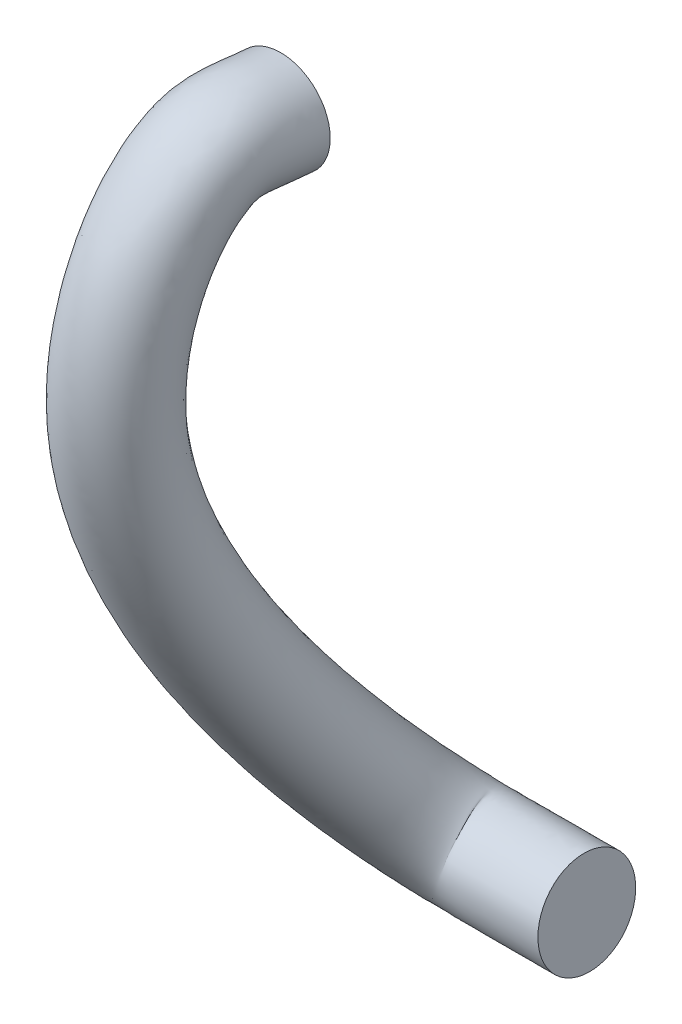
ISO-10303-21;
HEADER;
FILE_DESCRIPTION(('STEP AP214'),'2;1');
FILE_NAME('part.step','',(''),(''),'','','');
FILE_SCHEMA(('AUTOMOTIVE_DESIGN { 1 0 10303 214 1 1 1 1 }'));
ENDSEC;
DATA;
#1=APPLICATION_CONTEXT('core data for automotive mechanical design processes');
#2=APPLICATION_PROTOCOL_DEFINITION('international standard','automotive_design',2000,#1);
#3=PRODUCT_CONTEXT('',#1,'mechanical');
#4=PRODUCT('Part','Part','',(#3));
#5=PRODUCT_RELATED_PRODUCT_CATEGORY('part','',(#4));
#6=PRODUCT_DEFINITION_FORMATION('','',#4);
#7=PRODUCT_DEFINITION_CONTEXT('part definition',#1,'design');
#8=PRODUCT_DEFINITION('design','',#6,#7);
#9=PRODUCT_DEFINITION_SHAPE('','',#8);
#10=(LENGTH_UNIT() NAMED_UNIT(*) SI_UNIT(.MILLI.,.METRE.));
#11=(NAMED_UNIT(*) PLANE_ANGLE_UNIT() SI_UNIT($,.RADIAN.));
#12=(NAMED_UNIT(*) SI_UNIT($,.STERADIAN.) SOLID_ANGLE_UNIT());
#13=UNCERTAINTY_MEASURE_WITH_UNIT(LENGTH_MEASURE(1.E-05),#10,'distance_accuracy_value','');
#14=(GEOMETRIC_REPRESENTATION_CONTEXT(3) GLOBAL_UNCERTAINTY_ASSIGNED_CONTEXT((#13)) GLOBAL_UNIT_ASSIGNED_CONTEXT((#10,
#11,#12)) REPRESENTATION_CONTEXT('',''));
#15=CARTESIAN_POINT('',(0.,0.,0.));
#16=DIRECTION('',(0.,0.,1.));
#17=DIRECTION('',(1.,0.,0.));
#18=AXIS2_PLACEMENT_3D('',#15,#16,#17);
#19=CARTESIAN_POINT('',(46.8723096432657,-152.344827444227,-17.4642492568514));
#20=DIRECTION('',(0.997564274919886,0.068398965988282,-0.0136784083612078));
#21=DIRECTION('',(-0.0158311375425383,0.41299025410157,0.91059783938972));
#22=AXIS2_PLACEMENT_3D('',#19,#20,#21);
#23=PLANE('',#22);
#24=CARTESIAN_POINT('',(46.8723096432657,-152.344827444227,-17.4642492568514));
#25=DIRECTION('',(0.997564274919886,0.068398965988282,-0.0136784083612078));
#26=DIRECTION('',(-0.0158311375425383,0.41299025410157,0.91059783938972));
#27=AXIS2_PLACEMENT_3D('',#24,#25,#26);
#28=CIRCLE('',#27,12.0816832278209);
#29=CARTESIAN_POINT('',(46.6810428543407,-147.355210017994,-6.46269461340668));
#30=VERTEX_POINT('',#29);
#31=EDGE_CURVE('E49',#30,#30,#28,.T.);
#32=ORIENTED_EDGE('',*,*,#31,.T.);
#33=EDGE_LOOP('',(#32));
#34=FACE_BOUND('',#33,.T.);
#35=ADVANCED_FACE('F42',(#34),#23,.T.);
#36=CARTESIAN_POINT('',(0.,7.99999999999999,10.4295492610194));
#37=DIRECTION('',(0.,0.,1.));
#38=DIRECTION('',(1.,0.,0.));
#39=AXIS2_PLACEMENT_3D('',#36,#37,#38);
#40=PLANE('',#39);
#41=CARTESIAN_POINT('',(0.,7.99999999999999,10.4295492610194));
#42=DIRECTION('',(0.,0.,1.));
#43=DIRECTION('',(1.,0.,0.));
#44=AXIS2_PLACEMENT_3D('',#41,#42,#43);
#45=CIRCLE('',#44,12.0816832278209);
#46=CARTESIAN_POINT('',(12.0816832278209,7.99999999999999,10.4295492610194));
#47=VERTEX_POINT('',#46);
#48=EDGE_CURVE('E13',#47,#47,#45,.T.);
#49=ORIENTED_EDGE('',*,*,#48,.F.);
#50=EDGE_LOOP('',(#49));
#51=FACE_BOUND('',#50,.T.);
#52=ADVANCED_FACE('F58',(#51),#40,.F.);
#53=CARTESIAN_POINT('',(46.6810428543407,-147.355210017994,-6.46269461340668));
#54=CARTESIAN_POINT('',(39.3262097998034,-147.354504469335,-6.46203578437014));
#55=CARTESIAN_POINT('',(33.5769934802406,-147.317811529663,-6.42777255994892));
#56=CARTESIAN_POINT('',(26.5711675923774,-147.359707407181,-6.46689419667441));
#57=CARTESIAN_POINT('',(25.286097970162,-147.352185248158,-6.45987013629049));
#58=CARTESIAN_POINT('',(24.1567905634109,-147.264306361924,-6.37781037141243));
#59=CARTESIAN_POINT('',(23.9149832864291,-147.226321437925,-6.34234071461507));
#60=CARTESIAN_POINT('',(23.7329292686974,-147.183045343266,-6.30193025534197));
#61=CARTESIAN_POINT('',(23.7017016706803,-147.171124846769,-6.29079910447685));
#62=CARTESIAN_POINT('',(23.6843877630897,-147.156405284369,-6.27705423490371));
#63=CARTESIAN_POINT('',(23.6980314336886,-147.15298503443,-6.27473482181508));
#64=CARTESIAN_POINT('',(23.7844966105481,-147.088176709744,-6.31816988995223));
#65=CARTESIAN_POINT('',(23.7874113128732,-147.030759903331,-6.33691248012983));
#66=CARTESIAN_POINT('',(23.6696713984273,-146.834197680375,-6.31176815063174));
#67=CARTESIAN_POINT('',(23.5502265353473,-146.694634824091,-6.26752678012594));
#68=CARTESIAN_POINT('',(23.0459908212757,-146.102409104851,-6.0024662856428));
#69=CARTESIAN_POINT('',(22.5207506182551,-145.470679936501,-5.64402285949536));
#70=CARTESIAN_POINT('',(21.3436029585748,-143.679826343904,-4.57156591168552));
#71=CARTESIAN_POINT('',(20.6926839182283,-142.526140737636,-3.8628693506097));
#72=CARTESIAN_POINT('',(19.3957230698095,-139.746574736194,-2.20229481324738));
#73=CARTESIAN_POINT('',(18.7480249007694,-138.121619547683,-1.25170625658377));
#74=CARTESIAN_POINT('',(17.8046156894341,-135.372750603424,0.275422114659821));
#75=CARTESIAN_POINT('',(17.4942654533448,-134.404556500739,0.801418140340633));
#76=CARTESIAN_POINT('',(17.0341210036423,-132.879862552454,1.60727926437235));
#77=CARTESIAN_POINT('',(16.8817679460281,-132.35834654711,1.87730275107006));
#78=CARTESIAN_POINT('',(16.5777919054059,-131.297103799453,2.42749935980963));
#79=CARTESIAN_POINT('',(16.4215775624983,-130.796998792224,2.75400198597327));
#80=CARTESIAN_POINT('',(15.6321804455774,-128.444619626317,4.64750662327329));
#81=CARTESIAN_POINT('',(15.0341765715561,-126.422624364264,6.26509921218722));
#82=CARTESIAN_POINT('',(13.35984362043,-119.957995452389,11.2744039276151));
#83=CARTESIAN_POINT('',(12.4020569561247,-115.139285466073,14.8464063102899));
#84=CARTESIAN_POINT('',(10.8019620564083,-104.79562839004,22.0018102922029));
#85=CARTESIAN_POINT('',(10.1582745834079,-99.2696969550804,25.5862857835965));
#86=CARTESIAN_POINT('',(9.14941916771378,-87.7847523351602,32.3489198308528));
#87=CARTESIAN_POINT('',(8.78389558652798,-81.8253996375717,35.5274719386433));
#88=CARTESIAN_POINT('',(8.28678844830683,-69.7303062489096,41.072409138263));
#89=CARTESIAN_POINT('',(8.15508103134938,-63.5944962888598,43.439136267063));
#90=CARTESIAN_POINT('',(8.09760702143258,-54.4420576836695,46.0775782789694));
#91=CARTESIAN_POINT('',(8.10178557216762,-51.3996914736936,46.8051035185246));
#92=CARTESIAN_POINT('',(8.1508767877051,-45.3615489029363,47.9050675031429));
#93=CARTESIAN_POINT('',(8.1954191546888,-42.3658721744474,48.2812513092529));
#94=CARTESIAN_POINT('',(8.38224760211764,-33.5765991286358,48.7657938120709));
#95=CARTESIAN_POINT('',(8.57343514265213,-27.9233328691278,48.2958119952271));
#96=CARTESIAN_POINT('',(9.03844734116521,-17.4089184268522,46.1686640109355));
#97=CARTESIAN_POINT('',(9.31227937756318,-12.5478168730762,44.5113831543138));
#98=CARTESIAN_POINT('',(9.74591998821989,-6.1777542666417,41.4335578136026));
#99=CARTESIAN_POINT('',(9.89427898796746,-4.20798835207525,40.309002925725));
#100=CARTESIAN_POINT('',(10.1920905580153,-0.630272757944209,37.9126060132177));
#101=CARTESIAN_POINT('',(10.3415434359476,0.977704256561046,36.6407708850514));
#102=CARTESIAN_POINT('',(10.6350191460346,3.77666680885408,33.999523154372));
#103=CARTESIAN_POINT('',(10.7790468548754,4.96769275023458,32.6300676901931));
#104=CARTESIAN_POINT('',(11.0550952146466,6.87593608213431,29.8433422873456));
#105=CARTESIAN_POINT('',(11.1871258389691,7.59306717894347,28.4259058386526));
#106=CARTESIAN_POINT('',(11.3981395492126,8.36920514053756,25.9903864791876));
#107=CARTESIAN_POINT('',(11.4835373260147,8.57302603534941,24.947524135769));
#108=CARTESIAN_POINT('',(11.6437514920846,8.77868615939265,22.7032978069096));
#109=CARTESIAN_POINT('',(11.7183242869456,8.78291080508711,21.50507866091));
#110=CARTESIAN_POINT('',(11.8516716546094,8.67140088045078,18.8696137977178));
#111=CARTESIAN_POINT('',(11.910491064052,8.55623126606928,17.4325627999443));
#112=CARTESIAN_POINT('',(12.010032031132,8.28770722619904,14.2166127718697));
#113=CARTESIAN_POINT('',(12.0508005029002,8.13432528798159,12.4374109556366));
#114=CARTESIAN_POINT('',(12.0816832278209,7.99999999999999,10.4295492610194));
#115=CARTESIAN_POINT('',(48.3225328275354,-169.299493329263,3.5183984676284));
#116=CARTESIAN_POINT('',(40.9265935953737,-169.30413274027,3.51406626678963));
#117=CARTESIAN_POINT('',(35.1777470175627,-169.267833886642,3.5479615007374));
#118=CARTESIAN_POINT('',(28.3197583872084,-169.289648837694,3.52759108142707));
#119=CARTESIAN_POINT('',(26.7745043950187,-169.332092176533,3.48795823498167));
#120=CARTESIAN_POINT('',(24.6739309077153,-169.308167425506,3.51029874846284));
#121=CARTESIAN_POINT('',(24.0095310137029,-169.286497264017,3.53053396575994));
#122=CARTESIAN_POINT('',(23.055103476577,-169.217874123053,3.59461305295002));
#123=CARTESIAN_POINT('',(22.7438298485864,-169.188959560795,3.62161296480469));
#124=CARTESIAN_POINT('',(22.131269202879,-169.115426418907,3.69027692486969));
#125=CARTESIAN_POINT('',(21.828494917489,-169.06910250824,3.7334652235133));
#126=CARTESIAN_POINT('',(21.0502646782626,-168.784482163918,3.97917565109304));
#127=CARTESIAN_POINT('',(20.5536629922259,-168.54659659225,4.18724320558655));
#128=CARTESIAN_POINT('',(19.5899412903257,-167.956745597442,4.70367470547351));
#129=CARTESIAN_POINT('',(19.1231372772606,-167.604790525441,5.01202138122829));
#130=CARTESIAN_POINT('',(17.7896093422249,-166.374811337766,6.08236205692369));
#131=CARTESIAN_POINT('',(16.9915856270266,-165.322339009494,6.99057284584814));
#132=CARTESIAN_POINT('',(15.6723268067095,-162.778158366846,9.11723910751972));
#133=CARTESIAN_POINT('',(15.1505858480183,-161.287690173223,10.3349482936972));
#134=CARTESIAN_POINT('',(14.4401750808353,-157.894719485064,12.9758473787553));
#135=CARTESIAN_POINT('',(14.251837689961,-155.992194535804,14.3992595740737));
#136=CARTESIAN_POINT('',(14.2383682486751,-152.835551916572,16.5961184433081));
#137=CARTESIAN_POINT('',(14.2784413634667,-151.732728621322,17.3384992952798));
#138=CARTESIAN_POINT('',(14.4040468245239,-150.002699697687,18.4540266787565));
#139=CARTESIAN_POINT('',(14.4605203704871,-149.41166338128,18.8257284419528));
#140=CARTESIAN_POINT('',(14.5795023024812,-148.211349356613,19.5693290243472));
#141=CARTESIAN_POINT('',(14.521311126696,-147.658681285054,19.9570157489038));
#142=CARTESIAN_POINT('',(13.6436732530142,-145.124669553253,22.0180017577745));
#143=CARTESIAN_POINT('',(12.9530331761835,-142.953730912551,23.7668227006119));
#144=CARTESIAN_POINT('',(11.0670302015911,-136.006262976381,29.1983305935982));
#145=CARTESIAN_POINT('',(9.99312376012656,-130.827239141036,33.0742783630343));
#146=CARTESIAN_POINT('',(8.18803479416763,-119.636269467604,40.8987128398724));
#147=CARTESIAN_POINT('',(7.45574006932936,-113.624054713839,44.8486215343993));
#148=CARTESIAN_POINT('',(6.29004184446055,-100.953486151015,52.4187297215952));
#149=CARTESIAN_POINT('',(5.85635348100824,-94.2961425952818,56.0405873828511));
#150=CARTESIAN_POINT('',(5.24629905038265,-80.4378386412946,62.5429008002531));
#151=CARTESIAN_POINT('',(5.0695765286306,-73.2376006378103,65.4281048915224));
#152=CARTESIAN_POINT('',(4.97422376145035,-62.0162740439187,68.8214360774599));
#153=CARTESIAN_POINT('',(4.97086727674967,-58.2044449684249,69.7956508189118));
#154=CARTESIAN_POINT('',(5.01881121814163,-50.428520020313,71.3398398216853));
#155=CARTESIAN_POINT('',(5.06240181464793,-46.4635789727801,71.9128816399316));
#156=CARTESIAN_POINT('',(5.32934316992795,-34.4573565393655,72.8158977890925));
#157=CARTESIAN_POINT('',(5.60326301443228,-26.7749265355596,72.3295366814482));
#158=CARTESIAN_POINT('',(6.2828788759364,-12.3503865425674,69.7181603852396));
#159=CARTESIAN_POINT('',(6.68818512589037,-5.60510522155182,67.6026497098793));
#160=CARTESIAN_POINT('',(7.36494125531301,3.69675986348148,63.3834905361716));
#161=CARTESIAN_POINT('',(7.60215839038109,6.66305042931356,61.8000271547389));
#162=CARTESIAN_POINT('',(8.09956264469272,12.3199734841861,58.2401703680209));
#163=CARTESIAN_POINT('',(8.35963138728846,15.0121730651069,56.2656957399877));
#164=CARTESIAN_POINT('',(8.90895258721733,20.0994374027579,51.7933372464843));
#165=CARTESIAN_POINT('',(9.19832020307126,22.5007730957146,49.2965806597686));
#166=CARTESIAN_POINT('',(9.82081739011056,26.8691227226206,43.497253948284));
#167=CARTESIAN_POINT('',(10.1555505392265,28.8495565570129,40.180092396612));
#168=CARTESIAN_POINT('',(10.7723752115367,31.4073886520485,33.5044977585374));
#169=CARTESIAN_POINT('',(11.0147642485255,32.1187992810424,30.5724075993451));
#170=CARTESIAN_POINT('',(11.4160063748161,32.8520740174571,25.2883761006927));
#171=CARTESIAN_POINT('',(11.5698745571738,32.9130491830068,22.9516661826688));
#172=CARTESIAN_POINT('',(11.800058735526,32.8452518115349,18.8919393607614));
#173=CARTESIAN_POINT('',(11.8795647358332,32.7179497579755,17.1429343645437));
#174=CARTESIAN_POINT('',(12.0033211019393,32.4473214331532,13.7847819073646));
#175=CARTESIAN_POINT('',(12.0476149463455,32.2976917433759,12.1695541979118));
#176=CARTESIAN_POINT('',(12.0816832278208,32.1633664556417,10.4295492610194));
#177=CARTESIAN_POINT('',(48.7050664053855,-179.278728181728,-18.484710819261));
#178=CARTESIAN_POINT('',(41.2097316321492,-179.284613185129,-18.4902061319636));
#179=CARTESIAN_POINT('',(35.4615511528925,-179.249342646265,-18.4572711207307));
#180=CARTESIAN_POINT('',(28.9614781785147,-179.264660893613,-18.4715750320364));
#181=CARTESIAN_POINT('',(26.7787757663176,-179.352919610378,-18.5539894759766));
#182=CARTESIAN_POINT('',(22.3617983649245,-179.211870645277,-18.422280422633));
#183=CARTESIAN_POINT('',(20.6954779980961,-179.112177368079,-18.329188586342));
#184=CARTESIAN_POINT('',(17.9382770848652,-178.771257627554,-18.0108437033288));
#185=CARTESIAN_POINT('',(16.9773796057766,-178.625267605249,-17.8745207772763));
#186=CARTESIAN_POINT('',(14.9957211025965,-178.249537889706,-17.5236709492305));
#187=CARTESIAN_POINT('',(13.9740455226479,-178.019359902259,-17.3070881338512));
#188=CARTESIAN_POINT('',(11.0684063470461,-177.23696789434,-16.3923433374842));
#189=CARTESIAN_POINT('',(9.32481419849113,-176.605356567186,-15.6744653228909));
#190=CARTESIAN_POINT('',(6.17397821676013,-175.197065388322,-14.0874888485099));
#191=CARTESIAN_POINT('',(4.76467127732383,-174.421213313579,-13.2191014895188));
#192=CARTESIAN_POINT('',(0.983635772668773,-171.98450213548,-10.4856134781254));
#193=CARTESIAN_POINT('',(-0.95012440263334,-170.224994840077,-8.50165631240843));
#194=CARTESIAN_POINT('',(-4.05695830631519,-166.627478678718,-4.36935421617158));
#195=CARTESIAN_POINT('',(-5.23245923071736,-164.780019231559,-2.21131810928936));
#196=CARTESIAN_POINT('',(-7.03835035745409,-160.98651070177,2.28999403492533));
#197=CARTESIAN_POINT('',(-7.66517324558671,-159.038627418172,4.63601169934682));
#198=CARTESIAN_POINT('',(-8.23524954091159,-156.011416881687,8.2900437566395));
#199=CARTESIAN_POINT('',(-8.36273341948665,-154.984650051127,9.53021087598441));
#200=CARTESIAN_POINT('',(-8.46106539579447,-153.413166355432,11.4185197089181));
#201=CARTESIAN_POINT('',(-8.47503768688551,-152.884824472228,12.0549376580465));
#202=CARTESIAN_POINT('',(-8.48546204175648,-151.813872292965,13.3262906944492));
#203=CARTESIAN_POINT('',(-8.59006780578481,-151.248590014563,13.885793324507));
#204=CARTESIAN_POINT('',(-9.63396199860292,-148.276368092095,16.3326981091977));
#205=CARTESIAN_POINT('',(-10.4204151347471,-145.783327701936,18.3194175504812));
#206=CARTESIAN_POINT('',(-12.5430033267265,-138.005144995978,24.4064980344323));
#207=CARTESIAN_POINT('',(-13.7027052764563,-132.407945808094,28.5952048233288));
#208=CARTESIAN_POINT('',(-15.6322278076221,-120.526789909391,36.9168652790819));
#209=CARTESIAN_POINT('',(-16.4004260453012,-114.244500448885,41.0490954228787));
#210=CARTESIAN_POINT('',(-17.6172203128164,-101.132513052218,48.9046467994885));
#211=CARTESIAN_POINT('',(-18.0653961560412,-94.3044607190345,52.6288064721927));
#212=CARTESIAN_POINT('',(-18.6952994869613,-80.1907623291911,59.2826497908136));
#213=CARTESIAN_POINT('',(-18.8771303082137,-72.905953101808,62.2162720244741));
#214=CARTESIAN_POINT('',(-18.9784354857659,-61.6329473515198,65.6604169883555));
#215=CARTESIAN_POINT('',(-18.9834730658968,-57.8166522704071,66.6479953132267));
#216=CARTESIAN_POINT('',(-18.9391035003592,-50.0610662785524,68.2170462486135));
#217=CARTESIAN_POINT('',(-18.8964539277588,-46.1207598908861,68.7941598756766));
#218=CARTESIAN_POINT('',(-18.641037078457,-34.2388547576686,69.7743701385196));
#219=CARTESIAN_POINT('',(-18.3758729866077,-26.6271076266832,69.3534581016404));
#220=CARTESIAN_POINT('',(-17.7155015689566,-12.3196554595548,66.8977616331546));
#221=CARTESIAN_POINT('',(-17.3206869940644,-5.62078106670161,64.8724266949871));
#222=CARTESIAN_POINT('',(-16.6606714232088,3.62613340409987,60.8074019980979));
#223=CARTESIAN_POINT('',(-16.4292000648967,6.57648141978663,59.2784695859147));
#224=CARTESIAN_POINT('',(-15.9436754978848,12.2054488980756,55.8356912745995));
#225=CARTESIAN_POINT('',(-15.6897377847457,14.8855357942812,53.9236941779346));
#226=CARTESIAN_POINT('',(-15.1533290689375,19.9531604553878,49.589166100154));
#227=CARTESIAN_POINT('',(-14.8707558491065,22.3467054811375,47.1678131855914));
#228=CARTESIAN_POINT('',(-14.2629017102582,26.7113367896693,41.5413941150655));
#229=CARTESIAN_POINT('',(-13.9360839374492,28.6956171178196,38.3224920846882));
#230=CARTESIAN_POINT('',(-13.3333639396677,31.2901702165176,31.8387802096028));
#231=CARTESIAN_POINT('',(-13.0998907629378,31.9956277853455,29.0355600546835));
#232=CARTESIAN_POINT('',(-12.7168719908506,32.7446931543585,24.0692333494505));
#233=CARTESIAN_POINT('',(-12.5716874321526,32.8215882624046,21.9147495458999));
#234=CARTESIAN_POINT('',(-12.3539926960975,32.7892249459273,18.2011159923175));
#235=CARTESIAN_POINT('',(-12.2784742158725,32.6802870195827,16.6163614635944));
#236=CARTESIAN_POINT('',(-12.1593287716572,32.4359596606723,13.5486347258609));
#237=CARTESIAN_POINT('',(-12.11575150932,32.2945061867687,12.0603543291304));
#238=CARTESIAN_POINT('',(-12.0816832278208,32.1633664556417,10.4295492610194));
#239=CARTESIAN_POINT('',(47.0635764321907,-157.334444870459,-28.4658039002961));
#240=CARTESIAN_POINT('',(39.6093478365789,-157.33498491404,-28.4663081830785));
#241=CARTESIAN_POINT('',(33.8607976155703,-157.299320289251,-28.4330051814125));
#242=CARTESIAN_POINT('',(27.2128873836837,-157.334719463112,-28.4660603101393));
#243=CARTESIAN_POINT('',(25.2903693414622,-157.373012682004,-28.5018178472488));
#244=CARTESIAN_POINT('',(21.8446580206194,-157.168009581695,-28.3103895425083));
#245=CARTESIAN_POINT('',(20.600930270823,-157.052001541987,-28.202063266717));
#246=CARTESIAN_POINT('',(18.6161028769853,-156.736428847767,-27.9073870116208));
#247=CARTESIAN_POINT('',(17.9352514278703,-156.607432891226,-27.7869328465589));
#248=CARTESIAN_POINT('',(16.5488396628073,-156.290516755165,-27.4910021090029));
#249=CARTESIAN_POINT('',(15.8435820388478,-156.103242428451,-27.3152881791789));
#250=CARTESIAN_POINT('',(13.8026382793309,-155.540662440161,-26.6896888785307));
#251=CARTESIAN_POINT('',(12.5585625191384,-155.089519878272,-26.198621008607));
#252=CARTESIAN_POINT('',(10.2537083248617,-154.07451747125,-25.1029317046155));
#253=CARTESIAN_POINT('',(9.19176053541121,-153.511057612228,-24.4986496508723));
#254=CARTESIAN_POINT('',(6.24001725171813,-151.712099902565,-22.5704418206933));
#255=CARTESIAN_POINT('',(4.57904058859765,-150.37333576707,-21.1362520177519));
#256=CARTESIAN_POINT('',(1.61431784554761,-147.529146655789,-18.0581592353768));
#257=CARTESIAN_POINT('',(0.309638839492532,-146.01846979595,-16.4091357535948));
#258=CARTESIAN_POINT('',(-2.08280236847991,-142.838365952923,-12.8881481570788));
#259=CARTESIAN_POINT('',(-3.16898603477778,-141.168052430059,-11.0149541313128));
#260=CARTESIAN_POINT('',(-4.66900210015292,-138.548615568534,-8.03065257200772));
#261=CARTESIAN_POINT('',(-5.14690932960948,-137.656477930554,-7.0068702789548));
#262=CARTESIAN_POINT('',(-5.83099121667568,-136.290329210194,-5.42822770546598));
#263=CARTESIAN_POINT('',(-6.05379011134421,-135.831507638057,-4.8934880328368));
#264=CARTESIAN_POINT('',(-6.48717243883201,-134.899626735805,-3.81553897008776));
#265=CARTESIAN_POINT('',(-6.68980136998276,-134.386907521735,-3.31722043842344));
#266=CARTESIAN_POINT('',(-7.64545480603845,-131.59631816515,-1.03779702530352));
#267=CARTESIAN_POINT('',(-8.33927173937315,-129.252221153639,0.817694062059039));
#268=CARTESIAN_POINT('',(-10.2501899078902,-121.956877472006,6.48257136844402));
#269=CARTESIAN_POINT('',(-11.2937720804581,-116.719992133108,10.367332770573));
#270=CARTESIAN_POINT('',(-13.0183005453814,-105.686148831849,18.0199627314238));
#271=CARTESIAN_POINT('',(-13.6978915312256,-99.8901426901268,21.78675967207));
#272=CARTESIAN_POINT('',(-14.7578429895603,-87.9637792363627,28.8348369087521));
#273=CARTESIAN_POINT('',(-15.1378540505157,-81.833717761301,32.115691027979));
#274=CARTESIAN_POINT('',(-15.654810089043,-69.4832299368295,37.8121581288293));
#275=CARTESIAN_POINT('',(-15.7916258054977,-63.2628487528464,40.2273034000258));
#276=CARTESIAN_POINT('',(-15.8550522257823,-54.0587309912761,42.9165591898594));
#277=CARTESIAN_POINT('',(-15.8525547704789,-51.0118987756704,43.6574480128448));
#278=CARTESIAN_POINT('',(-15.8070379307958,-44.994095161181,44.7822739300657));
#279=CARTESIAN_POINT('',(-15.7634365877198,-42.0230530925432,45.1625295450159));
#280=CARTESIAN_POINT('',(-15.5881326462635,-33.3580973469592,45.7242661614627));
#281=CARTESIAN_POINT('',(-15.4057008583832,-27.7755139602468,45.31973341541));
#282=CARTESIAN_POINT('',(-14.9599331037324,-17.3781873438442,43.3482652588598));
#283=CARTESIAN_POINT('',(-14.6965927423968,-12.5634927182178,41.7811601394094));
#284=CARTESIAN_POINT('',(-14.2796926902993,-6.24838072602741,38.857469275535));
#285=CARTESIAN_POINT('',(-14.1370794673114,-4.29455736160217,37.7874453568989));
#286=CARTESIAN_POINT('',(-13.8511475845613,-0.744797344054762,35.5081269197981));
#287=CARTESIAN_POINT('',(-13.7078257360883,0.851066985735366,34.298769323));
#288=CARTESIAN_POINT('',(-13.4272625101186,3.6303898614839,31.79535200804));
#289=CARTESIAN_POINT('',(-13.2900291973023,4.81362513565602,30.5013002160144));
#290=CARTESIAN_POINT('',(-13.0286238857221,6.71815014918439,27.8874824541285));
#291=CARTESIAN_POINT('',(-12.9045086377066,7.43912773975011,26.5683055267301));
#292=CARTESIAN_POINT('',(-12.7075996019918,8.25198670500661,24.3246689302521));
#293=CARTESIAN_POINT('',(-12.6311176854481,8.44985453965254,23.4106765911066));
#294=CARTESIAN_POINT('',(-12.4891268735826,8.67130529629402,21.4841550556684));
#295=CARTESIAN_POINT('',(-12.4232377023808,8.69144988448489,20.4681620241422));
#296=CARTESIAN_POINT('',(-12.3023797770141,8.61537401484315,18.1787904292728));
#297=CARTESIAN_POINT('',(-12.2475478876536,8.51856852767374,16.9059898989943));
#298=CARTESIAN_POINT('',(-12.1526178424645,8.27634545372075,13.9804655903666));
#299=CARTESIAN_POINT('',(-12.1125659527653,8.13113973137773,12.3282110868585));
#300=CARTESIAN_POINT('',(-12.0816832278209,8.00000000000001,10.4295492610194));
#301=CARTESIAN_POINT('',(45.4220864589959,-135.39016155919,-38.4468969813312));
#302=CARTESIAN_POINT('',(38.0089640410086,-135.385356642951,-38.4424102341933));
#303=CARTESIAN_POINT('',(32.2600440782482,-135.349297932236,-38.4087392420944));
#304=CARTESIAN_POINT('',(25.4642965888528,-135.40477803261,-38.4605455882422));
#305=CARTESIAN_POINT('',(23.8019629166067,-135.39310575363,-38.4496462185209));
#306=CARTESIAN_POINT('',(21.3275176763142,-135.124148518114,-38.1984986623835));
#307=CARTESIAN_POINT('',(20.5063825435499,-134.991825715895,-38.074937947092));
#308=CARTESIAN_POINT('',(19.2939286691053,-134.70160006798,-37.8039303199128));
#309=CARTESIAN_POINT('',(18.8931232499642,-134.589598177204,-37.6993449158414));
#310=CARTESIAN_POINT('',(18.1019582230182,-134.331495620625,-37.4583332687754));
#311=CARTESIAN_POINT('',(17.7131185550476,-134.187124954643,-37.3234882245067));
#312=CARTESIAN_POINT('',(16.5368702116157,-133.844356985982,-36.9870344195772));
#313=CARTESIAN_POINT('',(15.7923108397857,-133.573683189359,-36.722776694323));
#314=CARTESIAN_POINT('',(14.3334384329633,-132.951969554178,-36.1183745607211));
#315=CARTESIAN_POINT('',(13.6188497934986,-132.600901910878,-35.7781978122259));
#316=CARTESIAN_POINT('',(11.4963987307676,-131.439697669651,-34.6552701632612));
#317=CARTESIAN_POINT('',(10.1082055798286,-130.521676694064,-33.7708477230954));
#318=CARTESIAN_POINT('',(7.28559399741044,-128.43081463286,-31.746964254582));
#319=CARTESIAN_POINT('',(5.8517369097025,-127.25692036034,-30.6069533979002));
#320=CARTESIAN_POINT('',(2.87274562049428,-124.690221204075,-28.066290349083));
#321=CARTESIAN_POINT('',(1.32720117603122,-123.297477441946,-26.6659199619725));
#322=CARTESIAN_POINT('',(-1.1027546593943,-121.085814255381,-24.3513489006549));
#323=CARTESIAN_POINT('',(-1.9310852397324,-120.32830580998,-23.543951433894));
#324=CARTESIAN_POINT('',(-3.20091703755687,-119.167492064956,-22.2749751198501));
#325=CARTESIAN_POINT('',(-3.63254253580295,-118.778190803887,-21.8419137237201));
#326=CARTESIAN_POINT('',(-4.48888283590754,-117.985381178645,-20.9573686346247));
#327=CARTESIAN_POINT('',(-4.78953493418072,-117.525225028908,-20.5202342013539));
#328=CARTESIAN_POINT('',(-5.65694761347407,-114.916268238205,-18.4082921598048));
#329=CARTESIAN_POINT('',(-6.25812834399919,-112.721114605342,-16.6840294263631));
#330=CARTESIAN_POINT('',(-7.95737648905387,-105.908609948035,-11.4413552975442));
#331=CARTESIAN_POINT('',(-8.88483888445993,-101.032038458122,-7.8605392821828));
#332=CARTESIAN_POINT('',(-10.4043732831406,-90.8455077543077,-0.876939816234285));
#333=CARTESIAN_POINT('',(-10.99535701715,-85.5357849313684,2.52442392126127));
#334=CARTESIAN_POINT('',(-11.8984656663042,-74.7950454205078,8.76502701801565));
#335=CARTESIAN_POINT('',(-12.2103119449901,-69.3629748035675,11.6025755837653));
#336=CARTESIAN_POINT('',(-12.6143206911246,-58.775697544468,16.3416664668451));
#337=CARTESIAN_POINT('',(-12.7061213027817,-53.6197444038848,18.2383347755775));
#338=CARTESIAN_POINT('',(-12.7316689657987,-46.4845146310324,20.1727013913633));
#339=CARTESIAN_POINT('',(-12.7216364750609,-44.2071452809337,20.6669007124629));
#340=CARTESIAN_POINT('',(-12.6749723612323,-39.9271240438096,21.347501611518));
#341=CARTESIAN_POINT('',(-12.6304192476809,-37.9253462942002,21.5308992143551));
#342=CARTESIAN_POINT('',(-12.53522821407,-32.4773399362497,21.6741621844057));
#343=CARTESIAN_POINT('',(-12.4355287301588,-28.9239202938104,21.2860087291796));
#344=CARTESIAN_POINT('',(-12.2043646385083,-22.4367192281336,19.798768884565));
#345=CARTESIAN_POINT('',(-12.0724984907292,-19.5062043697339,18.6898935838316));
#346=CARTESIAN_POINT('',(-11.8987139573899,-16.1228948561547,16.9075365529722));
#347=CARTESIAN_POINT('',(-11.8449588697259,-15.165596142991,16.2964211278831));
#348=CARTESIAN_POINT('',(-11.7586196712377,-13.6950435861851,15.1805625649967));
#349=CARTESIAN_POINT('',(-11.7259136874308,-13.1834018228105,14.6738444680654));
#350=CARTESIAN_POINT('',(-11.7011959512996,-12.69238073242,14.001537915926));
#351=CARTESIAN_POINT('',(-11.7093025454983,-12.7194552098255,13.8347872464374));
#352=CARTESIAN_POINT('',(-11.7943460611861,-13.2750364913005,14.2335707931915));
#353=CARTESIAN_POINT('',(-11.8729333379641,-13.8173616383193,14.814118968772));
#354=CARTESIAN_POINT('',(-12.081835264316,-14.7861968065043,16.8105576509013));
#355=CARTESIAN_POINT('',(-12.1623446079583,-15.0959187060404,17.7857931275296));
#356=CARTESIAN_POINT('',(-12.2613817563145,-15.4020825617704,18.8990767618862));
#357=CARTESIAN_POINT('',(-12.274787972609,-15.4386884934348,19.0215745023844));
#358=CARTESIAN_POINT('',(-12.2507668579307,-15.558476916241,18.1564648662281));
#359=CARTESIAN_POINT('',(-12.2166215594348,-15.6431499642352,17.1956183343943));
#360=CARTESIAN_POINT('',(-12.1459069132718,-15.8832687532308,14.4122964548723));
#361=CARTESIAN_POINT('',(-12.1093803962105,-16.0322267240132,12.5960678445867));
#362=CARTESIAN_POINT('',(-12.0816832278209,-16.1633664556417,10.4295492610194));
#363=CARTESIAN_POINT('',(45.0395528811459,-125.410926706725,-16.4437876944418));
#364=CARTESIAN_POINT('',(37.7258260042333,-125.4048761984,-16.4381378355299));
#365=CARTESIAN_POINT('',(31.9762399429184,-125.367789172685,-16.4035066206352));
#366=CARTESIAN_POINT('',(24.8225767975465,-125.429765976668,-16.4613794747759));
#367=CARTESIAN_POINT('',(23.7976915453052,-125.372278319784,-16.4076985075626));
#368=CARTESIAN_POINT('',(23.6396502191064,-125.220445298343,-16.2659194912877));
#369=CARTESIAN_POINT('',(23.8204355591554,-125.166145611834,-16.2152153949901));
#370=CARTESIAN_POINT('',(24.4107550608177,-125.148216563479,-16.198473563634));
#371=CARTESIAN_POINT('',(24.6595734927741,-125.153290132744,-16.2032111737584));
#372=CARTESIAN_POINT('',(25.2375063233006,-125.197384149831,-16.2443853946771));
#373=CARTESIAN_POINT('',(25.5675679498881,-125.23686756062,-16.2829348671435));
#374=CARTESIAN_POINT('',(26.5187285428335,-125.39187125557,-16.6155154309975));
#375=CARTESIAN_POINT('',(27.0211596335204,-125.514923214413,-16.8610681658462));
#376=CARTESIAN_POINT('',(27.7494015065289,-125.711649763308,-17.327211006737));
#377=CARTESIAN_POINT('',(27.9773157934339,-125.78447912274,-17.5470749414802));
#378=CARTESIAN_POINT('',(28.3023723003265,-125.830006871937,-18.0872946282093));
#379=CARTESIAN_POINT('',(28.0499156094837,-125.619020863507,-18.2786185648389));
#380=CARTESIAN_POINT('',(27.0148791104401,-124.581494320961,-18.2603709308907));
#381=CARTESIAN_POINT('',(26.2347819884382,-123.764591302049,-18.0606869949165));
#382=CARTESIAN_POINT('',(24.3512710587837,-121.598429987323,-17.3804370052501));
#383=CARTESIAN_POINT('',(23.2442121115778,-120.251044559561,-16.9026720872413));
#384=CARTESIAN_POINT('',(21.370863130193,-117.909949290275,-16.0452742139885));
#385=CARTESIAN_POINT('',(20.7100895432229,-117.076384380157,-15.7356630145986));
#386=CARTESIAN_POINT('',(19.6641951827606,-115.75702540722,-15.2394681500118));
#387=CARTESIAN_POINT('',(19.3030155215691,-115.30502971294,-15.0711229398127));
#388=CARTESIAN_POINT('',(18.5760815083307,-114.382858242293,-14.7143303047279));
#389=CARTESIAN_POINT('',(18.3218439983007,-113.935316299395,-14.4490117769572));
#390=CARTESIAN_POINT('',(17.6206876381406,-111.764569699381,-12.722988511228));
#391=CARTESIAN_POINT('',(17.1153199669288,-109.891517815978,-11.2366242762375));
#392=CARTESIAN_POINT('',(15.6526570392689,-103.909727928397,-6.64952273836797));
#393=CARTESIAN_POINT('',(14.8109901521229,-99.45133179111,-3.3814657424545));
#394=CARTESIAN_POINT('',(13.415889318649,-89.9549873124757,3.10490774453344));
#395=CARTESIAN_POINT('',(12.8608090974865,-84.915339196322,6.32395003279369));
#396=CARTESIAN_POINT('',(12.008796490967,-74.6160185193052,12.2791099401104));
#397=CARTESIAN_POINT('',(11.7114376920478,-69.3546566798616,15.0143564944354));
#398=CARTESIAN_POINT('',(11.3272778462311,-59.0227738565247,19.6019174762729));
#399=CARTESIAN_POINT('',(11.2405855340682,-53.9513919399093,21.4501676426036));
#400=CARTESIAN_POINT('',(11.2209902814148,-46.8678413234202,23.3337204804788));
#401=CARTESIAN_POINT('',(11.2327038675855,-44.5949379789622,23.8145562181374));
#402=CARTESIAN_POINT('',(11.2829423572685,-40.2945777855595,24.4702951846005));
#403=CARTESIAN_POINT('',(11.3284364947297,-38.2681653761148,24.6496209785741));
#404=CARTESIAN_POINT('',(11.4351520343074,-32.6958417179061,24.7156898350494));
#405=CARTESIAN_POINT('',(11.5436072708719,-29.0717392026961,24.2620873090059));
#406=CARTESIAN_POINT('',(11.794015806394,-22.467450311137,22.6191676366315));
#407=CARTESIAN_POINT('',(11.9363736292359,-19.4905285246005,21.4201165987483));
#408=CARTESIAN_POINT('',(12.1268987211267,-16.0522683967649,19.4836250910336));
#409=CARTESIAN_POINT('',(12.1863995855538,-15.079027133464,18.8179786967111));
#410=CARTESIAN_POINT('',(12.2846184713379,-13.5805190000745,17.5850416584144));
#411=CARTESIAN_POINT('',(12.3234554846066,-13.0567645519848,17.0158460301151));
#412=CARTESIAN_POINT('',(12.3610857048519,-12.5461037850498,16.2057090622597));
#413=CARTESIAN_POINT('',(12.3597735066794,-12.5653875952455,15.9635547206175));
#414=CARTESIAN_POINT('',(12.2893730391826,-13.117250558352,16.1894306264072));
#415=CARTESIAN_POINT('',(12.2187011387117,-13.663422199126,16.6717192806932));
#416=CARTESIAN_POINT('',(12.0239038868885,-14.6689783709734,18.4762751998378));
#417=CARTESIAN_POINT('',(11.952310403504,-14.9727472103435,19.3226406721929));
#418=CARTESIAN_POINT('',(11.8714966093531,-15.2947016986718,20.1182195131265));
#419=CARTESIAN_POINT('',(11.8667740167174,-15.3472275728326,20.0584911391512));
#420=CARTESIAN_POINT('',(11.9032845736928,-15.5024500506334,18.8472882346741));
#421=CARTESIAN_POINT('',(11.9414173922708,-15.605487225837,17.722191235345));
#422=CARTESIAN_POINT('',(12.0167429603248,-15.8719069807552,14.6484436363747));
#423=CARTESIAN_POINT('',(12.0539860594549,-16.0290411674127,12.7052677133613));
#424=CARTESIAN_POINT('',(12.0816832278208,-16.1633664556417,10.4295492610194));
#425=CARTESIAN_POINT('',(46.6810428543407,-147.355210017994,-6.46269461340668));
#426=CARTESIAN_POINT('',(39.3262097998034,-147.354504469335,-6.46203578437014));
#427=CARTESIAN_POINT('',(33.5769934802406,-147.317811529663,-6.42777255994892));
#428=CARTESIAN_POINT('',(26.5711675923774,-147.359707407181,-6.46689419667441));
#429=CARTESIAN_POINT('',(25.286097970162,-147.352185248158,-6.45987013629049));
#430=CARTESIAN_POINT('',(24.1567905634109,-147.264306361924,-6.37781037141243));
#431=CARTESIAN_POINT('',(23.9149832864291,-147.226321437925,-6.34234071461507));
#432=CARTESIAN_POINT('',(23.7329292686974,-147.183045343266,-6.30193025534197));
#433=CARTESIAN_POINT('',(23.7017016706803,-147.171124846769,-6.29079910447685));
#434=CARTESIAN_POINT('',(23.6843877630897,-147.156405284369,-6.27705423490371));
#435=CARTESIAN_POINT('',(23.6980314336886,-147.15298503443,-6.27473482181508));
#436=CARTESIAN_POINT('',(23.7844966105481,-147.088176709744,-6.31816988995223));
#437=CARTESIAN_POINT('',(23.7874113128732,-147.030759903331,-6.33691248012983));
#438=CARTESIAN_POINT('',(23.6696713984273,-146.834197680375,-6.31176815063174));
#439=CARTESIAN_POINT('',(23.5502265353473,-146.694634824091,-6.26752678012594));
#440=CARTESIAN_POINT('',(23.0459908212757,-146.102409104851,-6.0024662856428));
#441=CARTESIAN_POINT('',(22.5207506182551,-145.470679936501,-5.64402285949536));
#442=CARTESIAN_POINT('',(21.3436029585748,-143.679826343904,-4.57156591168552));
#443=CARTESIAN_POINT('',(20.6926839182283,-142.526140737636,-3.8628693506097));
#444=CARTESIAN_POINT('',(19.3957230698095,-139.746574736194,-2.20229481324738));
#445=CARTESIAN_POINT('',(18.7480249007694,-138.121619547683,-1.25170625658377));
#446=CARTESIAN_POINT('',(17.8046156894341,-135.372750603424,0.275422114659821));
#447=CARTESIAN_POINT('',(17.4942654533448,-134.404556500739,0.801418140340633));
#448=CARTESIAN_POINT('',(17.0341210036423,-132.879862552454,1.60727926437235));
#449=CARTESIAN_POINT('',(16.8817679460281,-132.35834654711,1.87730275107006));
#450=CARTESIAN_POINT('',(16.5777919054059,-131.297103799453,2.42749935980963));
#451=CARTESIAN_POINT('',(16.4215775624983,-130.796998792224,2.75400198597327));
#452=CARTESIAN_POINT('',(15.6321804455774,-128.444619626317,4.64750662327329));
#453=CARTESIAN_POINT('',(15.0341765715561,-126.422624364264,6.26509921218722));
#454=CARTESIAN_POINT('',(13.35984362043,-119.957995452389,11.2744039276151));
#455=CARTESIAN_POINT('',(12.4020569561247,-115.139285466073,14.8464063102899));
#456=CARTESIAN_POINT('',(10.8019620564083,-104.79562839004,22.0018102922029));
#457=CARTESIAN_POINT('',(10.1582745834079,-99.2696969550804,25.5862857835965));
#458=CARTESIAN_POINT('',(9.14941916771378,-87.7847523351602,32.3489198308528));
#459=CARTESIAN_POINT('',(8.78389558652798,-81.8253996375717,35.5274719386433));
#460=CARTESIAN_POINT('',(8.28678844830683,-69.7303062489096,41.072409138263));
#461=CARTESIAN_POINT('',(8.15508103134938,-63.5944962888598,43.439136267063));
#462=CARTESIAN_POINT('',(8.09760702143258,-54.4420576836695,46.0775782789694));
#463=CARTESIAN_POINT('',(8.10178557216762,-51.3996914736936,46.8051035185246));
#464=CARTESIAN_POINT('',(8.1508767877051,-45.3615489029363,47.9050675031429));
#465=CARTESIAN_POINT('',(8.1954191546888,-42.3658721744474,48.2812513092529));
#466=CARTESIAN_POINT('',(8.38224760211764,-33.5765991286358,48.7657938120709));
#467=CARTESIAN_POINT('',(8.57343514265213,-27.9233328691278,48.2958119952271));
#468=CARTESIAN_POINT('',(9.03844734116521,-17.4089184268522,46.1686640109355));
#469=CARTESIAN_POINT('',(9.31227937756318,-12.5478168730762,44.5113831543138));
#470=CARTESIAN_POINT('',(9.74591998821989,-6.1777542666417,41.4335578136026));
#471=CARTESIAN_POINT('',(9.89427898796746,-4.20798835207525,40.309002925725));
#472=CARTESIAN_POINT('',(10.1920905580153,-0.630272757944209,37.9126060132177));
#473=CARTESIAN_POINT('',(10.3415434359476,0.977704256561046,36.6407708850514));
#474=CARTESIAN_POINT('',(10.6350191460346,3.77666680885408,33.999523154372));
#475=CARTESIAN_POINT('',(10.7790468548754,4.96769275023458,32.6300676901931));
#476=CARTESIAN_POINT('',(11.0550952146466,6.87593608213431,29.8433422873456));
#477=CARTESIAN_POINT('',(11.1871258389691,7.59306717894347,28.4259058386526));
#478=CARTESIAN_POINT('',(11.3981395492126,8.36920514053756,25.9903864791876));
#479=CARTESIAN_POINT('',(11.4835373260147,8.57302603534941,24.947524135769));
#480=CARTESIAN_POINT('',(11.6437514920846,8.77868615939265,22.7032978069096));
#481=CARTESIAN_POINT('',(11.7183242869456,8.78291080508711,21.50507866091));
#482=CARTESIAN_POINT('',(11.8516716546094,8.67140088045078,18.8696137977178));
#483=CARTESIAN_POINT('',(11.910491064052,8.55623126606928,17.4325627999443));
#484=CARTESIAN_POINT('',(12.010032031132,8.28770722619904,14.2166127718697));
#485=CARTESIAN_POINT('',(12.0508005029002,8.13432528798159,12.4374109556366));
#486=CARTESIAN_POINT('',(12.0816832278209,7.99999999999999,10.4295492610194));
#487=(BOUNDED_SURFACE() B_SPLINE_SURFACE(3,3,((#53,#54,#55,#56,#57,#58,#59,#60,#61,#62,#63,#64,
#65,#66,#67,#68,#69,#70,#71,#72,#73,#74,#75,#76,#77,#78,#79,#80,#81,#82,#83,#84,#85,#86,#87,#88,
#89,#90,#91,#92,#93,#94,#95,#96,#97,#98,#99,#100,#101,#102,#103,#104,#105,#106,#107,#108,#109,
#110,#111,#112,#113,#114),(#115,#116,#117,#118,#119,#120,#121,#122,#123,#124,#125,#126,#127,
#128,#129,#130,#131,#132,#133,#134,#135,#136,#137,#138,#139,#140,#141,#142,#143,#144,#145,#146,
#147,#148,#149,#150,#151,#152,#153,#154,#155,#156,#157,#158,#159,#160,#161,#162,#163,#164,#165,
#166,#167,#168,#169,#170,#171,#172,#173,#174,#175,#176),(#177,#178,#179,#180,#181,#182,#183,
#184,#185,#186,#187,#188,#189,#190,#191,#192,#193,#194,#195,#196,#197,#198,#199,#200,#201,#202,
#203,#204,#205,#206,#207,#208,#209,#210,#211,#212,#213,#214,#215,#216,#217,#218,#219,#220,#221,
#222,#223,#224,#225,#226,#227,#228,#229,#230,#231,#232,#233,#234,#235,#236,#237,#238),(#239,
#240,#241,#242,#243,#244,#245,#246,#247,#248,#249,#250,#251,#252,#253,#254,#255,#256,#257,#258,
#259,#260,#261,#262,#263,#264,#265,#266,#267,#268,#269,#270,#271,#272,#273,#274,#275,#276,#277,
#278,#279,#280,#281,#282,#283,#284,#285,#286,#287,#288,#289,#290,#291,#292,#293,#294,#295,#296,
#297,#298,#299,#300),(#301,#302,#303,#304,#305,#306,#307,#308,#309,#310,#311,#312,#313,#314,
#315,#316,#317,#318,#319,#320,#321,#322,#323,#324,#325,#326,#327,#328,#329,#330,#331,#332,#333,
#334,#335,#336,#337,#338,#339,#340,#341,#342,#343,#344,#345,#346,#347,#348,#349,#350,#351,#352,
#353,#354,#355,#356,#357,#358,#359,#360,#361,#362),(#363,#364,#365,#366,#367,#368,#369,#370,
#371,#372,#373,#374,#375,#376,#377,#378,#379,#380,#381,#382,#383,#384,#385,#386,#387,#388,#389,
#390,#391,#392,#393,#394,#395,#396,#397,#398,#399,#400,#401,#402,#403,#404,#405,#406,#407,#408,
#409,#410,#411,#412,#413,#414,#415,#416,#417,#418,#419,#420,#421,#422,#423,#424),(#425,#426,
#427,#428,#429,#430,#431,#432,#433,#434,#435,#436,#437,#438,#439,#440,#441,#442,#443,#444,#445,
#446,#447,#448,#449,#450,#451,#452,#453,#454,#455,#456,#457,#458,#459,#460,#461,#462,#463,#464,
#465,#466,#467,#468,#469,#470,#471,#472,#473,#474,#475,#476,#477,#478,#479,#480,#481,#482,#483,
#484,#485,#486)),.UNSPECIFIED.,.T.,.F.,.F.) B_SPLINE_SURFACE_WITH_KNOTS((4,3,4),(4,2,2,2,2,2,2,
2,2,2,2,2,2,2,2,2,2,2,2,2,2,2,2,2,2,2,2,2,2,2,4),(0.,0.5,1.),(0.,0.102642546086721,
0.135970046168919,0.152633796210018,0.160965671230567,0.169297546251117,0.184836685482143,
0.20037582471317,0.231454103175223,0.262532381637276,0.293610660099329,0.309149799330356,
0.316919368945869,0.324688938561382,0.355767217023435,0.417923773947541,0.480080330871647,
0.542236887795753,0.604393444719859,0.635471723181912,0.666550001643965,0.727817448818116,
0.789084895992268,0.819718619579343,0.850352343166419,0.880986066753495,0.91161979034057,
0.933714842755428,0.955809895170285,0.977904947585143,1.),
.UNSPECIFIED.) GEOMETRIC_REPRESENTATION_ITEM() RATIONAL_B_SPLINE_SURFACE(((1.,1.,1.,1.,1.,1.,1.,
1.,1.,1.,1.,1.,1.,1.,1.,1.,1.,1.,1.,1.,1.,1.,1.,1.,1.,1.,1.,1.,1.,1.,1.,1.,1.,1.,1.,1.,1.,1.,1.,
1.,1.,1.,1.,1.,1.,1.,1.,1.,1.,1.,1.,1.,1.,1.,1.,1.,1.,1.,1.,1.,1.,1.),(0.333333333333333,
0.333333333333333,0.333333333333333,0.333333333333333,0.333333333333333,0.333333333333333,
0.333333333333333,0.333333333333333,0.333333333333333,0.333333333333333,0.333333333333333,
0.333333333333333,0.333333333333333,0.333333333333333,0.333333333333333,0.333333333333333,
0.333333333333333,0.333333333333333,0.333333333333333,0.333333333333333,0.333333333333333,
0.333333333333333,0.333333333333333,0.333333333333333,0.333333333333333,0.333333333333333,
0.333333333333333,0.333333333333333,0.333333333333333,0.333333333333333,0.333333333333333,
0.333333333333333,0.333333333333333,0.333333333333333,0.333333333333333,0.333333333333333,
0.333333333333333,0.333333333333333,0.333333333333333,0.333333333333333,0.333333333333333,
0.333333333333333,0.333333333333333,0.333333333333333,0.333333333333333,0.333333333333333,
0.333333333333333,0.333333333333333,0.333333333333333,0.333333333333333,0.333333333333333,
0.333333333333333,0.333333333333333,0.333333333333333,0.333333333333333,0.333333333333333,
0.333333333333333,0.333333333333333,0.333333333333333,0.333333333333333,0.333333333333333,
0.333333333333333),(0.333333333333333,0.333333333333333,0.333333333333333,0.333333333333333,
0.333333333333333,0.333333333333333,0.333333333333333,0.333333333333333,0.333333333333333,
0.333333333333333,0.333333333333333,0.333333333333333,0.333333333333333,0.333333333333333,
0.333333333333333,0.333333333333333,0.333333333333333,0.333333333333333,0.333333333333333,
0.333333333333333,0.333333333333333,0.333333333333333,0.333333333333333,0.333333333333333,
0.333333333333333,0.333333333333333,0.333333333333333,0.333333333333333,0.333333333333333,
0.333333333333333,0.333333333333333,0.333333333333333,0.333333333333333,0.333333333333333,
0.333333333333333,0.333333333333333,0.333333333333333,0.333333333333333,0.333333333333333,
0.333333333333333,0.333333333333333,0.333333333333333,0.333333333333333,0.333333333333333,
0.333333333333333,0.333333333333333,0.333333333333333,0.333333333333333,0.333333333333333,
0.333333333333333,0.333333333333333,0.333333333333333,0.333333333333333,0.333333333333333,
0.333333333333333,0.333333333333333,0.333333333333333,0.333333333333333,0.333333333333333,
0.333333333333333,0.333333333333333,0.333333333333333),(1.,1.,1.,1.,1.,1.,1.,1.,1.,1.,1.,1.,1.,
1.,1.,1.,1.,1.,1.,1.,1.,1.,1.,1.,1.,1.,1.,1.,1.,1.,1.,1.,1.,1.,1.,1.,1.,1.,1.,1.,1.,1.,1.,1.,1.,
1.,1.,1.,1.,1.,1.,1.,1.,1.,1.,1.,1.,1.,1.,1.,1.,1.),(0.333333333333333,0.333333333333333,
0.333333333333333,0.333333333333333,0.333333333333333,0.333333333333333,0.333333333333333,
0.333333333333333,0.333333333333333,0.333333333333333,0.333333333333333,0.333333333333333,
0.333333333333333,0.333333333333333,0.333333333333333,0.333333333333333,0.333333333333333,
0.333333333333333,0.333333333333333,0.333333333333333,0.333333333333333,0.333333333333333,
0.333333333333333,0.333333333333333,0.333333333333333,0.333333333333333,0.333333333333333,
0.333333333333333,0.333333333333333,0.333333333333333,0.333333333333333,0.333333333333333,
0.333333333333333,0.333333333333333,0.333333333333333,0.333333333333333,0.333333333333333,
0.333333333333333,0.333333333333333,0.333333333333333,0.333333333333333,0.333333333333333,
0.333333333333333,0.333333333333333,0.333333333333333,0.333333333333333,0.333333333333333,
0.333333333333333,0.333333333333333,0.333333333333333,0.333333333333333,0.333333333333333,
0.333333333333333,0.333333333333333,0.333333333333333,0.333333333333333,0.333333333333333,
0.333333333333333,0.333333333333333,0.333333333333333,0.333333333333333,0.333333333333333),
(0.333333333333333,0.333333333333333,0.333333333333333,0.333333333333333,0.333333333333333,
0.333333333333333,0.333333333333333,0.333333333333333,0.333333333333333,0.333333333333333,
0.333333333333333,0.333333333333333,0.333333333333333,0.333333333333333,0.333333333333333,
0.333333333333333,0.333333333333333,0.333333333333333,0.333333333333333,0.333333333333333,
0.333333333333333,0.333333333333333,0.333333333333333,0.333333333333333,0.333333333333333,
0.333333333333333,0.333333333333333,0.333333333333333,0.333333333333333,0.333333333333333,
0.333333333333333,0.333333333333333,0.333333333333333,0.333333333333333,0.333333333333333,
0.333333333333333,0.333333333333333,0.333333333333333,0.333333333333333,0.333333333333333,
0.333333333333333,0.333333333333333,0.333333333333333,0.333333333333333,0.333333333333333,
0.333333333333333,0.333333333333333,0.333333333333333,0.333333333333333,0.333333333333333,
0.333333333333333,0.333333333333333,0.333333333333333,0.333333333333333,0.333333333333333,
0.333333333333333,0.333333333333333,0.333333333333333,0.333333333333333,0.333333333333333,
0.333333333333333,0.333333333333333),(1.,1.,1.,1.,1.,1.,1.,1.,1.,1.,1.,1.,1.,1.,1.,1.,1.,1.,1.,
1.,1.,1.,1.,1.,1.,1.,1.,1.,1.,1.,1.,1.,1.,1.,1.,1.,1.,1.,1.,1.,1.,1.,1.,1.,1.,1.,1.,1.,1.,1.,1.,
1.,1.,1.,1.,1.,1.,1.,1.,1.,1.,1.))) REPRESENTATION_ITEM('') SURFACE());
#488=ORIENTED_EDGE('',*,*,#48,.T.);
#489=EDGE_LOOP('',(#488));
#490=FACE_BOUND('',#489,.T.);
#491=ORIENTED_EDGE('',*,*,#31,.F.);
#492=EDGE_LOOP('',(#491));
#493=FACE_BOUND('',#492,.T.);
#494=ADVANCED_FACE('F56',(#490,#493),#487,.F.);
#495=CLOSED_SHELL('',(#35,#52,#494));
#496=MANIFOLD_SOLID_BREP('B2',#495);
#497=ADVANCED_BREP_SHAPE_REPRESENTATION('',(#18,#496),#14);
#498=SHAPE_DEFINITION_REPRESENTATION(#9,#497);
ENDSEC;
END-ISO-10303-21;
